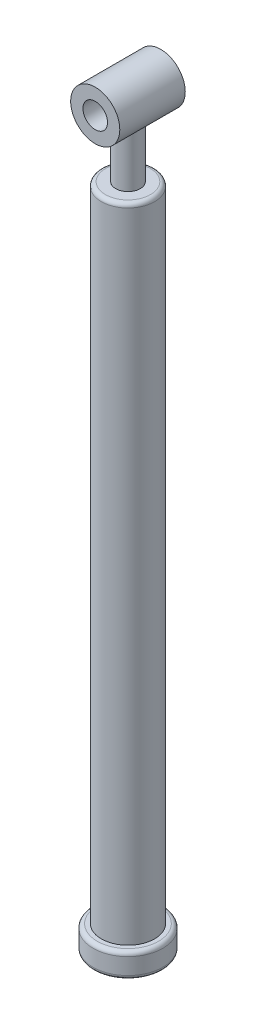
ISO-10303-21;
HEADER;
FILE_DESCRIPTION(('STEP AP214'),'2;1');
FILE_NAME('part.step','',(''),(''),'','','');
FILE_SCHEMA(('AUTOMOTIVE_DESIGN { 1 0 10303 214 1 1 1 1 }'));
ENDSEC;
DATA;
#1=APPLICATION_CONTEXT('core data for automotive mechanical design processes');
#2=APPLICATION_PROTOCOL_DEFINITION('international standard','automotive_design',2000,#1);
#3=PRODUCT_CONTEXT('',#1,'mechanical');
#4=PRODUCT('Part','Part','',(#3));
#5=PRODUCT_RELATED_PRODUCT_CATEGORY('part','',(#4));
#6=PRODUCT_DEFINITION_FORMATION('','',#4);
#7=PRODUCT_DEFINITION_CONTEXT('part definition',#1,'design');
#8=PRODUCT_DEFINITION('design','',#6,#7);
#9=PRODUCT_DEFINITION_SHAPE('','',#8);
#10=(LENGTH_UNIT() NAMED_UNIT(*) SI_UNIT(.MILLI.,.METRE.));
#11=(NAMED_UNIT(*) PLANE_ANGLE_UNIT() SI_UNIT($,.RADIAN.));
#12=(NAMED_UNIT(*) SI_UNIT($,.STERADIAN.) SOLID_ANGLE_UNIT());
#13=UNCERTAINTY_MEASURE_WITH_UNIT(LENGTH_MEASURE(1.E-05),#10,'distance_accuracy_value','');
#14=(GEOMETRIC_REPRESENTATION_CONTEXT(3) GLOBAL_UNCERTAINTY_ASSIGNED_CONTEXT((#13)) GLOBAL_UNIT_ASSIGNED_CONTEXT((#10,
#11,#12)) REPRESENTATION_CONTEXT('',''));
#15=CARTESIAN_POINT('',(0.,0.,0.));
#16=DIRECTION('',(0.,0.,1.));
#17=DIRECTION('',(1.,0.,0.));
#18=AXIS2_PLACEMENT_3D('',#15,#16,#17);
#19=CARTESIAN_POINT('',(0.,779.442146097064,40.));
#20=DIRECTION('',(0.,0.,-1.));
#21=DIRECTION('',(-1.,0.,0.));
#22=AXIS2_PLACEMENT_3D('',#19,#20,#21);
#23=CYLINDRICAL_SURFACE('',#22,30.);
#24=CARTESIAN_POINT('',(0.,779.442146097064,40.));
#25=DIRECTION('',(0.,0.,1.));
#26=DIRECTION('',(1.,0.,0.));
#27=AXIS2_PLACEMENT_3D('',#24,#25,#26);
#28=CIRCLE('',#27,30.);
#29=CARTESIAN_POINT('',(30.,779.442146097064,40.));
#30=VERTEX_POINT('',#29);
#31=EDGE_CURVE('E56',#30,#30,#28,.T.);
#32=ORIENTED_EDGE('',*,*,#31,.F.);
#33=EDGE_LOOP('',(#32));
#34=FACE_BOUND('',#33,.T.);
#35=CARTESIAN_POINT('',(0.,779.442146097064,-40.));
#36=DIRECTION('',(0.,0.,1.));
#37=DIRECTION('',(1.,0.,0.));
#38=AXIS2_PLACEMENT_3D('',#35,#36,#37);
#39=CIRCLE('',#38,30.);
#40=CARTESIAN_POINT('',(30.,779.442146097064,-40.));
#41=VERTEX_POINT('',#40);
#42=EDGE_CURVE('E65',#41,#41,#39,.T.);
#43=ORIENTED_EDGE('',*,*,#42,.T.);
#44=EDGE_LOOP('',(#43));
#45=FACE_BOUND('',#44,.T.);
#46=CARTESIAN_POINT('',(0.,749.442146097064,-15.));
#47=CARTESIAN_POINT('',(0.394466621474773,749.442147295507,-14.9999986967893));
#48=CARTESIAN_POINT('',(0.788960822893599,749.449944471506,-14.9844217290986));
#49=CARTESIAN_POINT('',(1.57504384672488,749.480936793939,-14.9222912626951));
#50=CARTESIAN_POINT('',(1.96663133023564,749.504138638976,-14.8757242881962));
#51=CARTESIAN_POINT('',(2.74444839066597,749.565391762577,-14.752062134402));
#52=CARTESIAN_POINT('',(3.13066783309049,749.603467984655,-14.674915671778));
#53=CARTESIAN_POINT('',(3.89427274204149,749.693491579853,-14.4909926788045));
#54=CARTESIAN_POINT('',(4.27165908796738,749.745437565692,-14.3842191117729));
#55=CARTESIAN_POINT('',(5.01370255233915,749.861691561898,-14.1426464967422));
#56=CARTESIAN_POINT('',(5.37840368544459,749.925950425747,-14.0079586988167));
#57=CARTESIAN_POINT('',(6.09447648128183,750.06544728457,-13.7115835174738));
#58=CARTESIAN_POINT('',(6.4458478568234,750.140685515925,-13.5498955527415));
#59=CARTESIAN_POINT('',(7.13327098283041,750.300407487941,-13.2009461452605));
#60=CARTESIAN_POINT('',(7.46932832959931,750.384887812197,-13.0136941461367));
#61=CARTESIAN_POINT('',(8.12479620523717,750.561305690079,-12.6148696065897));
#62=CARTESIAN_POINT('',(8.44420009848105,750.653246179495,-12.4032874777652));
#63=CARTESIAN_POINT('',(9.08356730455507,750.848315582487,-11.9437431549207));
#64=CARTESIAN_POINT('',(9.40240338911197,750.951784853023,-11.6943566948693));
#65=CARTESIAN_POINT('',(10.0182110858624,751.162447156006,-11.1713323045258));
#66=CARTESIAN_POINT('',(10.3151814463611,751.269640401116,-10.8976929878613));
#67=CARTESIAN_POINT('',(10.8860835918351,751.485280150469,-10.32744213221));
#68=CARTESIAN_POINT('',(11.1600008976787,751.593727394408,-10.0308163772597));
#69=CARTESIAN_POINT('',(11.6833254232375,751.809194569639,-9.41609706949251));
#70=CARTESIAN_POINT('',(11.9327280363632,751.916214229419,-9.09799950074793));
#71=CARTESIAN_POINT('',(12.424066666325,752.134265784922,-8.41621019135652));
#72=CARTESIAN_POINT('',(12.6639084928374,752.244961050151,-8.05089693128158));
#73=CARTESIAN_POINT('',(13.1116371457317,752.457957526934,-7.2990622568278));
#74=CARTESIAN_POINT('',(13.319537514021,752.560262287106,-6.91254992484984));
#75=CARTESIAN_POINT('',(13.7015816677248,752.752963853118,-6.12045119528937));
#76=CARTESIAN_POINT('',(13.8757356708104,752.843364260675,-5.71487061752193));
#77=CARTESIAN_POINT('',(14.1884178363296,753.008831162455,-4.8871710698948));
#78=CARTESIAN_POINT('',(14.3269499463523,753.083899355593,-4.46505393858206));
#79=CARTESIAN_POINT('',(14.5593818816456,753.211611733183,-3.6331274396609));
#80=CARTESIAN_POINT('',(14.6554546162323,753.265328088736,-3.22409061692207));
#81=CARTESIAN_POINT('',(14.8131483158836,753.354239469646,-2.39742530260421));
#82=CARTESIAN_POINT('',(14.874770754679,753.389435287279,-1.97979717934039));
#83=CARTESIAN_POINT('',(14.9625716596024,753.43976111762,-1.13997809784132));
#84=CARTESIAN_POINT('',(14.9887801055065,753.45490810248,-0.717791304375877));
#85=CARTESIAN_POINT('',(15.0054120092055,753.464507112002,0.127503752153176));
#86=CARTESIAN_POINT('',(14.9958388811994,753.458961111143,0.550611923450808));
#87=CARTESIAN_POINT('',(14.9443693637688,753.429331567052,1.34318604493253));
#88=CARTESIAN_POINT('',(14.9064815133301,753.407547739686,1.71300749674338));
#89=CARTESIAN_POINT('',(14.8036048078167,753.348913396595,2.44761394651883));
#90=CARTESIAN_POINT('',(14.7386184959446,753.312064294758,2.81239941379459));
#91=CARTESIAN_POINT('',(14.5822778462236,753.224495974482,3.53465011425932));
#92=CARTESIAN_POINT('',(14.490916902454,753.173773281362,3.89211348946938));
#93=CARTESIAN_POINT('',(14.2827793732036,753.060026012499,4.5975509702241));
#94=CARTESIAN_POINT('',(14.1660014339124,752.997000781493,4.94552456919406));
#95=CARTESIAN_POINT('',(13.9051185945145,752.858881754333,5.63806138553529));
#96=CARTESIAN_POINT('',(13.7604466030275,752.783543576688,5.98236177926319));
#97=CARTESIAN_POINT('',(13.4467240006948,752.623932446868,6.65764881287026));
#98=CARTESIAN_POINT('',(13.2776646708395,752.539656302037,6.98863063670928));
#99=CARTESIAN_POINT('',(12.9163207460711,752.364314218284,7.63583954119817));
#100=CARTESIAN_POINT('',(12.7240325037789,752.273247213928,7.95206429387365));
#101=CARTESIAN_POINT('',(12.3173373374606,752.086465234208,8.56852275615358));
#102=CARTESIAN_POINT('',(12.1029286391493,751.990749886327,8.86875518007757));
#103=CARTESIAN_POINT('',(11.6244221009995,751.784434251639,9.48921356105552));
#104=CARTESIAN_POINT('',(11.357472454083,751.673488386244,9.80713018813411));
#105=CARTESIAN_POINT('',(10.7983337273758,751.451318045716,10.4195910602954));
#106=CARTESIAN_POINT('',(10.5061534517949,751.340093680814,10.7141433900476));
#107=CARTESIAN_POINT('',(9.89761910582899,751.120036441852,11.2787205781467));
#108=CARTESIAN_POINT('',(9.58124396820907,751.011205760685,11.5487236024523));
#109=CARTESIAN_POINT('',(8.92619254193719,750.798794551317,12.0621805278786));
#110=CARTESIAN_POINT('',(8.58752523371367,750.695211938327,12.3056450163623));
#111=CARTESIAN_POINT('',(7.87309152384945,750.491174047863,12.7751937974681));
#112=CARTESIAN_POINT('',(7.49633062281162,750.391092058694,12.999931268877));
#113=CARTESIAN_POINT('',(6.72229496746222,750.202285866385,13.4165538554255));
#114=CARTESIAN_POINT('',(6.32501925897371,750.113562192208,13.608437440683));
#115=CARTESIAN_POINT('',(5.51289034160742,749.950122249262,13.9571914545699));
#116=CARTESIAN_POINT('',(5.09804850978519,749.875397079192,14.1140841452216));
#117=CARTESIAN_POINT('',(4.25373396764101,749.74217456693,14.391076168471));
#118=CARTESIAN_POINT('',(3.8242629467431,749.683675358,14.5111797336915));
#119=CARTESIAN_POINT('',(2.99040123124786,749.588859121707,14.7045987917793));
#120=CARTESIAN_POINT('',(2.5868798773718,749.551106034983,14.7809658647281));
#121=CARTESIAN_POINT('',(1.77375891598891,749.491855715051,14.9004227368483));
#122=CARTESIAN_POINT('',(1.36415964033063,749.470357597644,14.9435143460633));
#123=CARTESIAN_POINT('',(0.542432179601597,749.444234683241,14.9958394822899));
#124=CARTESIAN_POINT('',(0.130305071717015,749.439603139848,15.0050865466642));
#125=CARTESIAN_POINT('',(-0.693142933067793,749.447328999489,14.9896332143828));
#126=CARTESIAN_POINT('',(-1.10446386484086,749.459685650663,14.9649343201033));
#127=CARTESIAN_POINT('',(-1.89104365716467,749.499420396752,14.8851569218173));
#128=CARTESIAN_POINT('',(-2.26662317638416,749.5255578811,14.8325856924447));
#129=CARTESIAN_POINT('',(-3.01155508953996,749.591344925546,14.6994449555599));
#130=CARTESIAN_POINT('',(-3.3809078825409,749.630993616242,14.6188772495211));
#131=CARTESIAN_POINT('',(-4.1110264311571,749.72287845267,14.4305792041858));
#132=CARTESIAN_POINT('',(-4.47179170797618,749.775115298457,14.322847354219));
#133=CARTESIAN_POINT('',(-5.18257720416893,749.890994207327,14.0812572947496));
#134=CARTESIAN_POINT('',(-5.53259697135359,749.954636749614,13.9473979874992));
#135=CARTESIAN_POINT('',(-6.22979935488014,750.093899879271,13.6505393721982));
#136=CARTESIAN_POINT('',(-6.57661612017299,750.169810399457,13.4868176517073));
#137=CARTESIAN_POINT('',(-7.25508680349726,750.330545697215,13.1343016754682));
#138=CARTESIAN_POINT('',(-7.5867405882688,750.415370553107,12.9455071994249));
#139=CARTESIAN_POINT('',(-8.23341158684488,750.592131947821,12.5441531585986));
#140=CARTESIAN_POINT('',(-8.5484261329624,750.684069621218,12.3315897999932));
#141=CARTESIAN_POINT('',(-9.16054648853284,750.87315838223,11.8839483671783));
#142=CARTESIAN_POINT('',(-9.45764526147815,750.970311490279,11.6488615394067));
#143=CARTESIAN_POINT('',(-10.060839107335,751.177487561265,11.1333715012893));
#144=CARTESIAN_POINT('',(-10.3649587307601,751.287838241047,10.8507851186195));
#145=CARTESIAN_POINT('',(-10.9485707923032,751.509615396475,10.2616154855624));
#146=CARTESIAN_POINT('',(-11.2280621358616,751.621041919691,9.95503116977256));
#147=CARTESIAN_POINT('',(-11.761157874002,751.842173386896,9.31919419442994));
#148=CARTESIAN_POINT('',(-12.0147464980315,751.951877248075,8.98992792709474));
#149=CARTESIAN_POINT('',(-12.4944228999317,752.166544046058,8.31037887445765));
#150=CARTESIAN_POINT('',(-12.7205059505332,752.271506165977,7.9600924919195));
#151=CARTESIAN_POINT('',(-13.1539172060939,752.478560634273,7.22261605950783));
#152=CARTESIAN_POINT('',(-13.3597919511091,752.580263034553,6.83445930863627));
#153=CARTESIAN_POINT('',(-13.737567232961,752.771486484548,6.03927850598327));
#154=CARTESIAN_POINT('',(-13.9094843147169,752.861013459742,5.632263762164));
#155=CARTESIAN_POINT('',(-14.2174151642657,753.024434165337,4.80217565091481));
#156=CARTESIAN_POINT('',(-14.353457663537,753.09834039671,4.37911544662187));
#157=CARTESIAN_POINT('',(-14.5879514095295,753.227462084545,3.51992505793523));
#158=CARTESIAN_POINT('',(-14.6864084766722,753.282680434832,3.08379690851378));
#159=CARTESIAN_POINT('',(-14.8366134509912,753.367606966636,2.24471283239244));
#160=CARTESIAN_POINT('',(-14.8919378625023,753.399255127652,1.84259137531863));
#161=CARTESIAN_POINT('',(-14.9698153891526,753.443940875464,1.03415900372212));
#162=CARTESIAN_POINT('',(-14.9923707330054,753.456979727928,0.62784837600944));
#163=CARTESIAN_POINT('',(-15.0043645010929,753.463903462384,-0.185270351507952));
#164=CARTESIAN_POINT('',(-14.9938151743778,753.45779542891,-0.59207821165113));
#165=CARTESIAN_POINT('',(-14.9397884815991,753.426695109376,-1.40275816467968));
#166=CARTESIAN_POINT('',(-14.8963124635393,753.401703596397,-1.8066303770658));
#167=CARTESIAN_POINT('',(-14.782795841076,753.337113376051,-2.56967168244058));
#168=CARTESIAN_POINT('',(-14.7156934571528,753.299140247165,-2.92942204471816));
#169=CARTESIAN_POINT('',(-14.5558242789108,753.209792764769,-3.64159381579528));
#170=CARTESIAN_POINT('',(-14.4630489945772,753.158413978335,-3.99401275857394));
#171=CARTESIAN_POINT('',(-14.2527724980854,753.043797808448,-4.68939648000359));
#172=CARTESIAN_POINT('',(-14.1352709916016,752.980560283837,-5.03236114606177));
#173=CARTESIAN_POINT('',(-13.8765585244577,752.843978733531,-5.70716431681698));
#174=CARTESIAN_POINT('',(-13.7353452308956,752.77063371353,-6.03900172289249));
#175=CARTESIAN_POINT('',(-13.4200195538922,752.610515641485,-6.71194905721806));
#176=CARTESIAN_POINT('',(-13.2443351386714,752.52317171998,-7.05218633738283));
#177=CARTESIAN_POINT('',(-12.8684192321828,752.341456839797,-7.71683729888762));
#178=CARTESIAN_POINT('',(-12.6681869929773,752.247085667042,-8.04125049766904));
#179=CARTESIAN_POINT('',(-12.2442855818538,752.053612744619,-8.67307599887715));
#180=CARTESIAN_POINT('',(-12.0206075892618,751.954509222253,-8.98048183592637));
#181=CARTESIAN_POINT('',(-11.5509819278367,751.753880916338,-9.57700095794094));
#182=CARTESIAN_POINT('',(-11.3050309237573,751.65235577185,-9.86611149224954));
#183=CARTESIAN_POINT('',(-10.7607009160988,751.436734113641,-10.4588881043877));
#184=CARTESIAN_POINT('',(-10.4595848725634,751.322612472886,-10.7600384098886));
#185=CARTESIAN_POINT('',(-9.83237263592983,751.097208941049,-11.3360350079751));
#186=CARTESIAN_POINT('',(-9.50628425805799,750.985926175943,-11.6108894699081));
#187=CARTESIAN_POINT('',(-8.83040064495091,750.768986651593,-12.1328673274452));
#188=CARTESIAN_POINT('',(-8.48058689086184,750.663334404832,-12.3799686513199));
#189=CARTESIAN_POINT('',(-7.75934315416602,750.460550310336,-12.8443186951047));
#190=CARTESIAN_POINT('',(-7.38791441884538,750.363417971771,-13.0615691351246));
#191=CARTESIAN_POINT('',(-6.62283359834586,750.179645683401,-13.4657554418474));
#192=CARTESIAN_POINT('',(-6.22904153096553,750.09308577155,-13.652463307469));
#193=CARTESIAN_POINT('',(-5.4242220501337,749.93373919963,-13.9917304392215));
#194=CARTESIAN_POINT('',(-5.01319217734311,749.860954513113,-14.1442848128173));
#195=CARTESIAN_POINT('',(-4.17809175418139,749.731514460225,-14.4130312534336));
#196=CARTESIAN_POINT('',(-3.75405665560562,749.674818931996,-14.52931393542));
#197=CARTESIAN_POINT('',(-2.89570983328149,749.579106787859,-14.7244141315277));
#198=CARTESIAN_POINT('',(-2.46140455781257,749.540079373423,-14.8032545313493));
#199=CARTESIAN_POINT('',(-1.6891252848581,749.487854597634,-14.9084233559045));
#200=CARTESIAN_POINT('',(-1.35247752005868,749.47074388402,-14.9427351996439));
#201=CARTESIAN_POINT('',(-0.677226647280006,749.447888962477,-14.9885243961843));
#202=CARTESIAN_POINT('',(-0.338623485589116,749.44214506828,-15.0000011187201));
#203=CARTESIAN_POINT('',(0.,749.442146097064,-15.));
#204=B_SPLINE_CURVE_WITH_KNOTS('',3,(#46,#47,#48,#49,#50,#51,#52,#53,#54,#55,#56,#57,#58,#59,
#60,#61,#62,#63,#64,#65,#66,#67,#68,#69,#70,#71,#72,#73,#74,#75,#76,#77,#78,#79,#80,#81,#82,#83,
#84,#85,#86,#87,#88,#89,#90,#91,#92,#93,#94,#95,#96,#97,#98,#99,#100,#101,#102,#103,#104,#105,
#106,#107,#108,#109,#110,#111,#112,#113,#114,#115,#116,#117,#118,#119,#120,#121,#122,#123,#124,
#125,#126,#127,#128,#129,#130,#131,#132,#133,#134,#135,#136,#137,#138,#139,#140,#141,#142,#143,
#144,#145,#146,#147,#148,#149,#150,#151,#152,#153,#154,#155,#156,#157,#158,#159,#160,#161,#162,
#163,#164,#165,#166,#167,#168,#169,#170,#171,#172,#173,#174,#175,#176,#177,#178,#179,#180,#181,
#182,#183,#184,#185,#186,#187,#188,#189,#190,#191,#192,#193,#194,#195,#196,#197,#198,#199,#200,
#201,#202,#203),.UNSPECIFIED.,.T.,.F.,(4,2,2,2,2,2,2,2,2,2,2,2,2,2,2,2,2,2,2,2,2,2,2,2,2,2,2,2,
2,2,2,2,2,2,2,2,2,2,2,2,2,2,2,2,2,2,2,2,2,2,2,2,2,2,2,2,2,2,2,2,2,2,2,2,2,2,2,2,2,2,2,2,2,2,2,2,
2,2,4),(0.,1.1830658838765,2.36664655205927,3.5522205995842,4.73767610811698,5.91849492154762,
7.09933916134025,8.27974835920213,9.46062435602726,10.7126941080732,11.9648354787242,
13.2177575130875,14.4709145374423,15.8216672017211,17.1718456109055,18.5216145742371,
19.8712338927467,21.1401798733571,22.4090715662491,23.6768884023223,24.9445842691984,
26.0604534443427,27.1762179182402,28.2922620948529,29.4083657309785,30.5501573825651,
31.6923582661888,32.8347387306653,33.9772108970053,35.2649000045823,36.5521415758273,
37.8405170382692,39.1283766165388,40.4765138704576,41.824713885002,43.1720536807209,
44.519238405488,45.7548292237563,46.9903528264139,48.2253821822107,49.4603568799793,
50.5994583371909,51.7384865108584,52.8775780428886,54.0167174442702,55.1883567290371,
56.3600063087792,57.53184316668,58.7041373111917,59.9914055352966,61.2787309408958,
62.5668355046821,63.8551611378707,65.2063513889894,66.5568816778176,67.9063270370394,
69.2555633384069,70.4752824018563,71.6949185050053,72.9141033841497,74.1332383531127,
75.2357784731186,76.3386836391977,77.4416019343193,78.5446288045349,79.7216927437009,
80.8987925552603,82.0763368112874,83.2540576898124,84.5752168212048,85.895964165236,
87.2177545550281,88.5394687467831,89.8706389488176,91.2019997209938,92.5300073067729,
93.8572021316087,94.872757858524,95.8883416150966),.UNSPECIFIED.);
#205=CARTESIAN_POINT('',(0.,749.442146097064,-15.));
#206=VERTEX_POINT('',#205);
#207=EDGE_CURVE('E11',#206,#206,#204,.T.);
#208=ORIENTED_EDGE('',*,*,#207,.F.);
#209=EDGE_LOOP('',(#208));
#210=FACE_BOUND('',#209,.T.);
#211=ADVANCED_FACE('F45',(#34,#45,#210),#23,.T.);
#212=CARTESIAN_POINT('',(0.,779.442146097064,40.));
#213=DIRECTION('',(0.,0.,-1.));
#214=DIRECTION('',(-1.,0.,0.));
#215=AXIS2_PLACEMENT_3D('',#212,#213,#214);
#216=CYLINDRICAL_SURFACE('',#215,15.);
#217=CARTESIAN_POINT('',(0.,779.442146097064,40.));
#218=DIRECTION('',(0.,0.,1.));
#219=DIRECTION('',(1.,0.,0.));
#220=AXIS2_PLACEMENT_3D('',#217,#218,#219);
#221=CIRCLE('',#220,15.);
#222=CARTESIAN_POINT('',(15.,779.442146097064,40.));
#223=VERTEX_POINT('',#222);
#224=EDGE_CURVE('E60',#223,#223,#221,.T.);
#225=ORIENTED_EDGE('',*,*,#224,.T.);
#226=EDGE_LOOP('',(#225));
#227=FACE_BOUND('',#226,.T.);
#228=CARTESIAN_POINT('',(0.,779.442146097064,-40.));
#229=DIRECTION('',(0.,0.,1.));
#230=DIRECTION('',(1.,0.,0.));
#231=AXIS2_PLACEMENT_3D('',#228,#229,#230);
#232=CIRCLE('',#231,15.);
#233=CARTESIAN_POINT('',(15.,779.442146097064,-40.));
#234=VERTEX_POINT('',#233);
#235=EDGE_CURVE('E69',#234,#234,#232,.T.);
#236=ORIENTED_EDGE('',*,*,#235,.F.);
#237=EDGE_LOOP('',(#236));
#238=FACE_BOUND('',#237,.T.);
#239=ADVANCED_FACE('F47',(#227,#238),#216,.F.);
#240=CARTESIAN_POINT('',(0.,0.,40.));
#241=DIRECTION('',(0.,0.,1.));
#242=DIRECTION('',(1.,0.,0.));
#243=AXIS2_PLACEMENT_3D('',#240,#241,#242);
#244=PLANE('',#243);
#245=ORIENTED_EDGE('',*,*,#224,.F.);
#246=EDGE_LOOP('',(#245));
#247=FACE_BOUND('',#246,.T.);
#248=ORIENTED_EDGE('',*,*,#31,.T.);
#249=EDGE_LOOP('',(#248));
#250=FACE_BOUND('',#249,.T.);
#251=ADVANCED_FACE('F80',(#247,#250),#244,.T.);
#252=CARTESIAN_POINT('',(0.,0.,-40.));
#253=DIRECTION('',(0.,0.,1.));
#254=DIRECTION('',(1.,0.,0.));
#255=AXIS2_PLACEMENT_3D('',#252,#253,#254);
#256=PLANE('',#255);
#257=ORIENTED_EDGE('',*,*,#235,.T.);
#258=EDGE_LOOP('',(#257));
#259=FACE_BOUND('',#258,.T.);
#260=ORIENTED_EDGE('',*,*,#42,.F.);
#261=EDGE_LOOP('',(#260));
#262=FACE_BOUND('',#261,.T.);
#263=ADVANCED_FACE('F77',(#259,#262),#256,.F.);
#264=CARTESIAN_POINT('',(0.,689.442146097064,0.));
#265=DIRECTION('',(0.,1.,0.));
#266=DIRECTION('',(0.,0.,1.));
#267=AXIS2_PLACEMENT_3D('',#264,#265,#266);
#268=PLANE('',#267);
#269=CARTESIAN_POINT('',(0.,689.442146097064,0.));
#270=DIRECTION('',(0.,1.,0.));
#271=DIRECTION('',(0.,0.,1.));
#272=AXIS2_PLACEMENT_3D('',#269,#270,#271);
#273=CIRCLE('',#272,15.);
#274=CARTESIAN_POINT('',(0.,689.442146097064,15.));
#275=VERTEX_POINT('',#274);
#276=EDGE_CURVE('E71',#275,#275,#273,.T.);
#277=ORIENTED_EDGE('',*,*,#276,.F.);
#278=EDGE_LOOP('',(#277));
#279=FACE_BOUND('',#278,.T.);
#280=ADVANCED_FACE('F79',(#279),#268,.F.);
#281=CARTESIAN_POINT('',(0.,809.444146097065,0.));
#282=DIRECTION('',(0.,-1.,0.));
#283=DIRECTION('',(0.,0.,-1.));
#284=AXIS2_PLACEMENT_3D('',#281,#282,#283);
#285=CYLINDRICAL_SURFACE('',#284,15.);
#286=ORIENTED_EDGE('',*,*,#276,.T.);
#287=EDGE_LOOP('',(#286));
#288=FACE_BOUND('',#287,.T.);
#289=ORIENTED_EDGE('',*,*,#207,.T.);
#290=EDGE_LOOP('',(#289));
#291=FACE_BOUND('',#290,.T.);
#292=ADVANCED_FACE('F83',(#288,#291),#285,.T.);
#293=CLOSED_SHELL('',(#211,#239,#251,#263,#280,#292));
#294=MANIFOLD_SOLID_BREP('B2',#293);
#295=CARTESIAN_POINT('',(0.,143.904834125233,0.));
#296=DIRECTION('',(0.,1.,0.));
#297=DIRECTION('',(0.,0.,1.));
#298=AXIS2_PLACEMENT_3D('',#295,#296,#297);
#299=CYLINDRICAL_SURFACE('',#298,15.);
#300=CARTESIAN_POINT('',(0.,689.442146097064,0.));
#301=DIRECTION('',(0.,1.,0.));
#302=DIRECTION('',(0.,0.,1.));
#303=AXIS2_PLACEMENT_3D('',#300,#301,#302);
#304=CIRCLE('',#303,15.0000000000001);
#305=CARTESIAN_POINT('',(0.,689.442146097064,15.0000000000001));
#306=VERTEX_POINT('',#305);
#307=EDGE_CURVE('E44',#306,#306,#304,.T.);
#308=ORIENTED_EDGE('',*,*,#307,.T.);
#309=EDGE_LOOP('',(#308));
#310=FACE_BOUND('',#309,.T.);
#311=CARTESIAN_POINT('',(0.,-120.557853902936,0.));
#312=DIRECTION('',(0.,1.,0.));
#313=DIRECTION('',(0.,0.,1.));
#314=AXIS2_PLACEMENT_3D('',#311,#312,#313);
#315=CIRCLE('',#314,15.);
#316=CARTESIAN_POINT('',(0.,-120.557853902936,15.));
#317=VERTEX_POINT('',#316);
#318=EDGE_CURVE('E194',#317,#317,#315,.T.);
#319=ORIENTED_EDGE('',*,*,#318,.F.);
#320=EDGE_LOOP('',(#319));
#321=FACE_BOUND('',#320,.T.);
#322=ADVANCED_FACE('F160',(#310,#321),#299,.F.);
#323=CARTESIAN_POINT('',(-27.5001,689.442146097064,0.));
#324=DIRECTION('',(0.,1.,0.));
#325=DIRECTION('',(0.,0.,1.));
#326=AXIS2_PLACEMENT_3D('',#323,#324,#325);
#327=PLANE('',#326);
#328=CARTESIAN_POINT('',(0.,689.442146097064,0.));
#329=DIRECTION('',(0.,1.,0.));
#330=DIRECTION('',(0.,0.,1.));
#331=AXIS2_PLACEMENT_3D('',#328,#329,#330);
#332=CIRCLE('',#331,27.5001);
#333=CARTESIAN_POINT('',(0.,689.442146097064,27.5001));
#334=VERTEX_POINT('',#333);
#335=EDGE_CURVE('E166',#334,#334,#332,.T.);
#336=ORIENTED_EDGE('',*,*,#335,.T.);
#337=EDGE_LOOP('',(#336));
#338=FACE_BOUND('',#337,.T.);
#339=ORIENTED_EDGE('',*,*,#307,.F.);
#340=EDGE_LOOP('',(#339));
#341=FACE_BOUND('',#340,.T.);
#342=ADVANCED_FACE('F202',(#338,#341),#327,.T.);
#343=CARTESIAN_POINT('',(0.,684.442246097064,0.));
#344=DIRECTION('',(0.,1.,0.));
#345=DIRECTION('',(0.,0.,1.));
#346=AXIS2_PLACEMENT_3D('',#343,#344,#345);
#347=TOROIDAL_SURFACE('',#346,27.5001,4.99990000000003);
#348=CARTESIAN_POINT('',(0.,684.442246097064,0.));
#349=DIRECTION('',(0.,1.,0.));
#350=DIRECTION('',(0.,0.,1.));
#351=AXIS2_PLACEMENT_3D('',#348,#349,#350);
#352=CIRCLE('',#351,32.5);
#353=CARTESIAN_POINT('',(0.,684.442246097064,32.5));
#354=VERTEX_POINT('',#353);
#355=EDGE_CURVE('E170',#354,#354,#352,.T.);
#356=ORIENTED_EDGE('',*,*,#355,.T.);
#357=EDGE_LOOP('',(#356));
#358=FACE_BOUND('',#357,.T.);
#359=ORIENTED_EDGE('',*,*,#335,.F.);
#360=EDGE_LOOP('',(#359));
#361=FACE_BOUND('',#360,.T.);
#362=ADVANCED_FACE('F206',(#358,#361),#347,.T.);
#363=CARTESIAN_POINT('',(0.,143.904834125233,0.));
#364=DIRECTION('',(0.,1.,0.));
#365=DIRECTION('',(0.,0.,1.));
#366=AXIS2_PLACEMENT_3D('',#363,#364,#365);
#367=CYLINDRICAL_SURFACE('',#366,32.5);
#368=CARTESIAN_POINT('',(0.,-95.5577539029356,0.));
#369=DIRECTION('',(0.,1.,0.));
#370=DIRECTION('',(0.,0.,1.));
#371=AXIS2_PLACEMENT_3D('',#368,#369,#370);
#372=CIRCLE('',#371,32.5);
#373=CARTESIAN_POINT('',(0.,-95.5577539029356,32.5));
#374=VERTEX_POINT('',#373);
#375=EDGE_CURVE('E174',#374,#374,#372,.T.);
#376=ORIENTED_EDGE('',*,*,#375,.T.);
#377=EDGE_LOOP('',(#376));
#378=FACE_BOUND('',#377,.T.);
#379=ORIENTED_EDGE('',*,*,#355,.F.);
#380=EDGE_LOOP('',(#379));
#381=FACE_BOUND('',#380,.T.);
#382=ADVANCED_FACE('F210',(#378,#381),#367,.T.);
#383=CARTESIAN_POINT('',(-37.5,-95.5577539029356,0.));
#384=DIRECTION('',(0.,1.,0.));
#385=DIRECTION('',(0.,0.,1.));
#386=AXIS2_PLACEMENT_3D('',#383,#384,#385);
#387=PLANE('',#386);
#388=CARTESIAN_POINT('',(0.,-95.5577539029356,0.));
#389=DIRECTION('',(0.,1.,0.));
#390=DIRECTION('',(0.,0.,1.));
#391=AXIS2_PLACEMENT_3D('',#388,#389,#390);
#392=CIRCLE('',#391,37.5);
#393=CARTESIAN_POINT('',(0.,-95.5577539029356,37.5));
#394=VERTEX_POINT('',#393);
#395=EDGE_CURVE('E179',#394,#394,#392,.T.);
#396=ORIENTED_EDGE('',*,*,#395,.T.);
#397=EDGE_LOOP('',(#396));
#398=FACE_BOUND('',#397,.T.);
#399=ORIENTED_EDGE('',*,*,#375,.F.);
#400=EDGE_LOOP('',(#399));
#401=FACE_BOUND('',#400,.T.);
#402=ADVANCED_FACE('F217',(#398,#401),#387,.T.);
#403=CARTESIAN_POINT('',(0.,-100.557753902936,0.));
#404=DIRECTION('',(0.,1.,0.));
#405=DIRECTION('',(0.,0.,1.));
#406=AXIS2_PLACEMENT_3D('',#403,#404,#405);
#407=TOROIDAL_SURFACE('',#406,37.5,5.);
#408=CARTESIAN_POINT('',(0.,-100.557753902936,0.));
#409=DIRECTION('',(0.,1.,0.));
#410=DIRECTION('',(0.,0.,1.));
#411=AXIS2_PLACEMENT_3D('',#408,#409,#410);
#412=CIRCLE('',#411,42.5);
#413=CARTESIAN_POINT('',(0.,-100.557753902936,42.5));
#414=VERTEX_POINT('',#413);
#415=EDGE_CURVE('E182',#414,#414,#412,.T.);
#416=ORIENTED_EDGE('',*,*,#415,.T.);
#417=EDGE_LOOP('',(#416));
#418=FACE_BOUND('',#417,.T.);
#419=ORIENTED_EDGE('',*,*,#395,.F.);
#420=EDGE_LOOP('',(#419));
#421=FACE_BOUND('',#420,.T.);
#422=ADVANCED_FACE('F221',(#418,#421),#407,.T.);
#423=CARTESIAN_POINT('',(0.,143.904834125233,0.));
#424=DIRECTION('',(0.,1.,0.));
#425=DIRECTION('',(0.,0.,1.));
#426=AXIS2_PLACEMENT_3D('',#423,#424,#425);
#427=CYLINDRICAL_SURFACE('',#426,42.5);
#428=CARTESIAN_POINT('',(0.,-120.557753902936,0.));
#429=DIRECTION('',(0.,1.,0.));
#430=DIRECTION('',(0.,0.,1.));
#431=AXIS2_PLACEMENT_3D('',#428,#429,#430);
#432=CIRCLE('',#431,42.5);
#433=CARTESIAN_POINT('',(0.,-120.557753902936,42.5));
#434=VERTEX_POINT('',#433);
#435=EDGE_CURVE('E185',#434,#434,#432,.T.);
#436=ORIENTED_EDGE('',*,*,#435,.T.);
#437=EDGE_LOOP('',(#436));
#438=FACE_BOUND('',#437,.T.);
#439=ORIENTED_EDGE('',*,*,#415,.F.);
#440=EDGE_LOOP('',(#439));
#441=FACE_BOUND('',#440,.T.);
#442=ADVANCED_FACE('F225',(#438,#441),#427,.T.);
#443=CARTESIAN_POINT('',(0.,-120.557753902936,0.));
#444=DIRECTION('',(0.,1.,0.));
#445=DIRECTION('',(0.,0.,1.));
#446=AXIS2_PLACEMENT_3D('',#443,#444,#445);
#447=TOROIDAL_SURFACE('',#446,37.5,4.99999999999999);
#448=CARTESIAN_POINT('',(0.,-125.557753902936,0.));
#449=DIRECTION('',(0.,1.,0.));
#450=DIRECTION('',(0.,0.,1.));
#451=AXIS2_PLACEMENT_3D('',#448,#449,#450);
#452=CIRCLE('',#451,37.5);
#453=CARTESIAN_POINT('',(0.,-125.557753902936,37.5));
#454=VERTEX_POINT('',#453);
#455=EDGE_CURVE('E188',#454,#454,#452,.T.);
#456=ORIENTED_EDGE('',*,*,#455,.T.);
#457=EDGE_LOOP('',(#456));
#458=FACE_BOUND('',#457,.T.);
#459=ORIENTED_EDGE('',*,*,#435,.F.);
#460=EDGE_LOOP('',(#459));
#461=FACE_BOUND('',#460,.T.);
#462=ADVANCED_FACE('F229',(#458,#461),#447,.T.);
#463=CARTESIAN_POINT('',(-19.9999,-125.557753902936,0.));
#464=DIRECTION('',(0.,-1.,0.));
#465=DIRECTION('',(0.,0.,-1.));
#466=AXIS2_PLACEMENT_3D('',#463,#464,#465);
#467=PLANE('',#466);
#468=CARTESIAN_POINT('',(0.,-125.557753902936,0.));
#469=DIRECTION('',(0.,1.,0.));
#470=DIRECTION('',(0.,0.,1.));
#471=AXIS2_PLACEMENT_3D('',#468,#469,#470);
#472=CIRCLE('',#471,19.9999);
#473=CARTESIAN_POINT('',(0.,-125.557753902936,19.9999));
#474=VERTEX_POINT('',#473);
#475=EDGE_CURVE('E191',#474,#474,#472,.T.);
#476=ORIENTED_EDGE('',*,*,#475,.T.);
#477=EDGE_LOOP('',(#476));
#478=FACE_BOUND('',#477,.T.);
#479=ORIENTED_EDGE('',*,*,#455,.F.);
#480=EDGE_LOOP('',(#479));
#481=FACE_BOUND('',#480,.T.);
#482=ADVANCED_FACE('F233',(#478,#481),#467,.T.);
#483=CARTESIAN_POINT('',(0.,-120.557853902936,0.));
#484=DIRECTION('',(0.,1.,0.));
#485=DIRECTION('',(0.,0.,1.));
#486=AXIS2_PLACEMENT_3D('',#483,#484,#485);
#487=TOROIDAL_SURFACE('',#486,19.9999,4.99990000000001);
#488=ORIENTED_EDGE('',*,*,#318,.T.);
#489=EDGE_LOOP('',(#488));
#490=FACE_BOUND('',#489,.T.);
#491=ORIENTED_EDGE('',*,*,#475,.F.);
#492=EDGE_LOOP('',(#491));
#493=FACE_BOUND('',#492,.T.);
#494=ADVANCED_FACE('F198',(#490,#493),#487,.T.);
#495=CLOSED_SHELL('',(#322,#342,#362,#382,#402,#422,#442,#462,#482,#494));
#496=MANIFOLD_SOLID_BREP('B6',#495);
#497=ADVANCED_BREP_SHAPE_REPRESENTATION('',(#18,#294,#496),#14);
#498=SHAPE_DEFINITION_REPRESENTATION(#9,#497);
ENDSEC;
END-ISO-10303-21;
